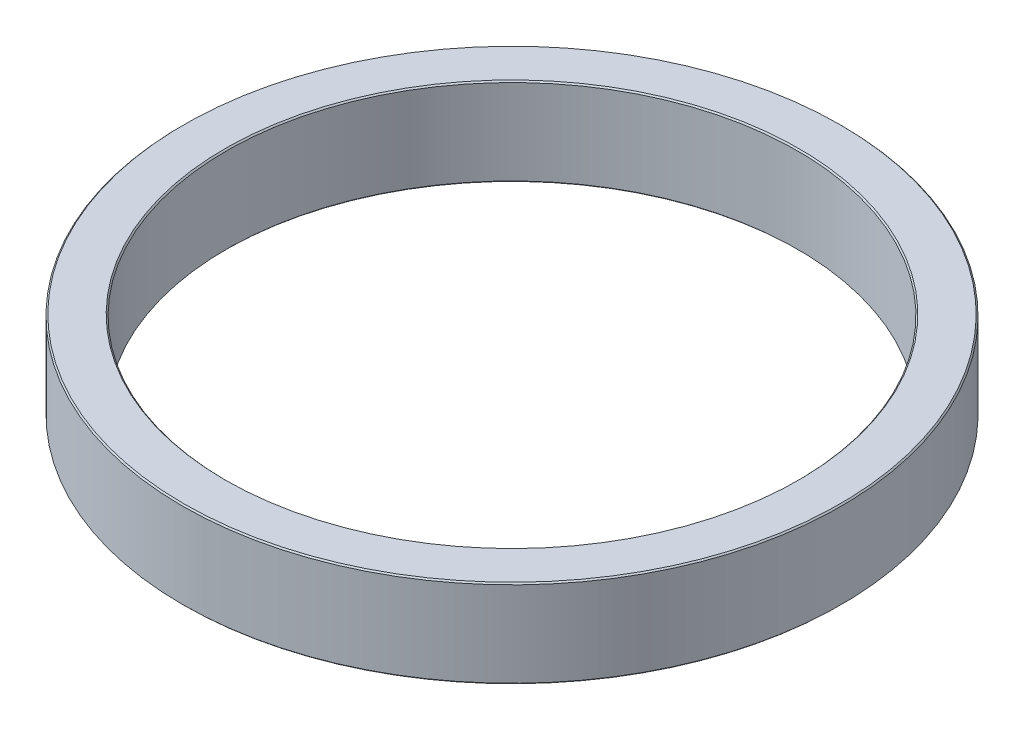
ISO-10303-21;
HEADER;
FILE_DESCRIPTION(('STEP AP214'),'2;1');
FILE_NAME('part.step','',(''),(''),'','','');
FILE_SCHEMA(('AUTOMOTIVE_DESIGN { 1 0 10303 214 1 1 1 1 }'));
ENDSEC;
DATA;
#1=APPLICATION_CONTEXT('core data for automotive mechanical design processes');
#2=APPLICATION_PROTOCOL_DEFINITION('international standard','automotive_design',2000,#1);
#3=PRODUCT_CONTEXT('',#1,'mechanical');
#4=PRODUCT('Part','Part','',(#3));
#5=PRODUCT_RELATED_PRODUCT_CATEGORY('part','',(#4));
#6=PRODUCT_DEFINITION_FORMATION('','',#4);
#7=PRODUCT_DEFINITION_CONTEXT('part definition',#1,'design');
#8=PRODUCT_DEFINITION('design','',#6,#7);
#9=PRODUCT_DEFINITION_SHAPE('','',#8);
#10=(LENGTH_UNIT() NAMED_UNIT(*) SI_UNIT(.MILLI.,.METRE.));
#11=(NAMED_UNIT(*) PLANE_ANGLE_UNIT() SI_UNIT($,.RADIAN.));
#12=(NAMED_UNIT(*) SI_UNIT($,.STERADIAN.) SOLID_ANGLE_UNIT());
#13=UNCERTAINTY_MEASURE_WITH_UNIT(LENGTH_MEASURE(1.E-05),#10,'distance_accuracy_value','');
#14=(GEOMETRIC_REPRESENTATION_CONTEXT(3) GLOBAL_UNCERTAINTY_ASSIGNED_CONTEXT((#13)) GLOBAL_UNIT_ASSIGNED_CONTEXT((#10,
#11,#12)) REPRESENTATION_CONTEXT('',''));
#15=CARTESIAN_POINT('',(0.,0.,0.));
#16=DIRECTION('',(0.,0.,1.));
#17=DIRECTION('',(1.,0.,0.));
#18=AXIS2_PLACEMENT_3D('',#15,#16,#17);
#19=CARTESIAN_POINT('',(0.,10.,0.));
#20=DIRECTION('',(0.,1.,0.));
#21=DIRECTION('',(0.,0.,1.));
#22=AXIS2_PLACEMENT_3D('',#19,#20,#21);
#23=PLANE('',#22);
#24=CARTESIAN_POINT('',(0.,10.,0.));
#25=DIRECTION('',(0.,1.,0.));
#26=DIRECTION('',(0.,0.,1.));
#27=AXIS2_PLACEMENT_3D('',#24,#25,#26);
#28=CIRCLE('',#27,37.345);
#29=CARTESIAN_POINT('',(0.,10.,37.345));
#30=VERTEX_POINT('',#29);
#31=EDGE_CURVE('E45',#30,#30,#28,.T.);
#32=ORIENTED_EDGE('',*,*,#31,.T.);
#33=EDGE_LOOP('',(#32));
#34=FACE_BOUND('',#33,.T.);
#35=CARTESIAN_POINT('',(0.,10.,0.));
#36=DIRECTION('',(0.,1.,0.));
#37=DIRECTION('',(0.,0.,1.));
#38=AXIS2_PLACEMENT_3D('',#35,#36,#37);
#39=CIRCLE('',#38,32.65);
#40=CARTESIAN_POINT('',(0.,10.,32.65));
#41=VERTEX_POINT('',#40);
#42=EDGE_CURVE('E49',#41,#41,#39,.F.);
#43=ORIENTED_EDGE('',*,*,#42,.T.);
#44=EDGE_LOOP('',(#43));
#45=FACE_BOUND('',#44,.T.);
#46=ADVANCED_FACE('F33',(#34,#45),#23,.T.);
#47=CARTESIAN_POINT('',(0.,0.,0.));
#48=DIRECTION('',(0.,1.,0.));
#49=DIRECTION('',(0.,0.,1.));
#50=AXIS2_PLACEMENT_3D('',#47,#48,#49);
#51=PLANE('',#50);
#52=CARTESIAN_POINT('',(0.,0.,0.));
#53=DIRECTION('',(0.,1.,0.));
#54=DIRECTION('',(0.,0.,1.));
#55=AXIS2_PLACEMENT_3D('',#52,#53,#54);
#56=CIRCLE('',#55,37.345);
#57=CARTESIAN_POINT('',(0.,0.,37.345));
#58=VERTEX_POINT('',#57);
#59=EDGE_CURVE('E54',#58,#58,#56,.F.);
#60=ORIENTED_EDGE('',*,*,#59,.T.);
#61=EDGE_LOOP('',(#60));
#62=FACE_BOUND('',#61,.T.);
#63=CARTESIAN_POINT('',(0.,0.,0.));
#64=DIRECTION('',(0.,1.,0.));
#65=DIRECTION('',(0.,0.,1.));
#66=AXIS2_PLACEMENT_3D('',#63,#64,#65);
#67=CIRCLE('',#66,32.65);
#68=CARTESIAN_POINT('',(0.,0.,32.65));
#69=VERTEX_POINT('',#68);
#70=EDGE_CURVE('E57',#69,#69,#67,.T.);
#71=ORIENTED_EDGE('',*,*,#70,.T.);
#72=EDGE_LOOP('',(#71));
#73=FACE_BOUND('',#72,.T.);
#74=ADVANCED_FACE('F79',(#62,#73),#51,.F.);
#75=CARTESIAN_POINT('',(0.,10.,0.));
#76=DIRECTION('',(0.,-1.,0.));
#77=DIRECTION('',(0.,0.,-1.));
#78=AXIS2_PLACEMENT_3D('',#75,#76,#77);
#79=CYLINDRICAL_SURFACE('',#78,37.495);
#80=CARTESIAN_POINT('',(0.,0.150000000000004,0.));
#81=DIRECTION('',(0.,1.,0.));
#82=DIRECTION('',(0.,0.,1.));
#83=AXIS2_PLACEMENT_3D('',#80,#81,#82);
#84=CIRCLE('',#83,37.495);
#85=CARTESIAN_POINT('',(0.,0.150000000000004,37.495));
#86=VERTEX_POINT('',#85);
#87=EDGE_CURVE('E60',#86,#86,#84,.T.);
#88=ORIENTED_EDGE('',*,*,#87,.T.);
#89=EDGE_LOOP('',(#88));
#90=FACE_BOUND('',#89,.T.);
#91=CARTESIAN_POINT('',(0.,9.85000000000004,0.));
#92=DIRECTION('',(0.,1.,0.));
#93=DIRECTION('',(0.,0.,1.));
#94=AXIS2_PLACEMENT_3D('',#91,#92,#93);
#95=CIRCLE('',#94,37.495);
#96=CARTESIAN_POINT('',(0.,9.85000000000004,37.495));
#97=VERTEX_POINT('',#96);
#98=EDGE_CURVE('E63',#97,#97,#95,.F.);
#99=ORIENTED_EDGE('',*,*,#98,.T.);
#100=EDGE_LOOP('',(#99));
#101=FACE_BOUND('',#100,.T.);
#102=ADVANCED_FACE('F67',(#90,#101),#79,.T.);
#103=CARTESIAN_POINT('',(0.,10.,0.));
#104=DIRECTION('',(0.,-1.,0.));
#105=DIRECTION('',(0.,0.,-1.));
#106=AXIS2_PLACEMENT_3D('',#103,#104,#105);
#107=CYLINDRICAL_SURFACE('',#106,32.5);
#108=CARTESIAN_POINT('',(0.,0.149999999999983,0.));
#109=DIRECTION('',(0.,1.,0.));
#110=DIRECTION('',(0.,0.,1.));
#111=AXIS2_PLACEMENT_3D('',#108,#109,#110);
#112=CIRCLE('',#111,32.5);
#113=CARTESIAN_POINT('',(0.,0.149999999999983,32.5));
#114=VERTEX_POINT('',#113);
#115=EDGE_CURVE('E10',#114,#114,#112,.F.);
#116=ORIENTED_EDGE('',*,*,#115,.T.);
#117=EDGE_LOOP('',(#116));
#118=FACE_BOUND('',#117,.T.);
#119=CARTESIAN_POINT('',(0.,9.84999999999999,0.));
#120=DIRECTION('',(0.,1.,0.));
#121=DIRECTION('',(0.,0.,1.));
#122=AXIS2_PLACEMENT_3D('',#119,#120,#121);
#123=CIRCLE('',#122,32.5);
#124=CARTESIAN_POINT('',(0.,9.84999999999999,32.5));
#125=VERTEX_POINT('',#124);
#126=EDGE_CURVE('E41',#125,#125,#123,.T.);
#127=ORIENTED_EDGE('',*,*,#126,.T.);
#128=EDGE_LOOP('',(#127));
#129=FACE_BOUND('',#128,.T.);
#130=ADVANCED_FACE('F104',(#118,#129),#107,.F.);
#131=CARTESIAN_POINT('',(0.,0.150000000000004,0.));
#132=DIRECTION('',(0.,1.,0.));
#133=DIRECTION('',(0.,0.,1.));
#134=AXIS2_PLACEMENT_3D('',#131,#132,#133);
#135=CONICAL_SURFACE('',#134,37.495,0.785398163397425);
#136=ORIENTED_EDGE('',*,*,#59,.F.);
#137=EDGE_LOOP('',(#136));
#138=FACE_BOUND('',#137,.T.);
#139=ORIENTED_EDGE('',*,*,#87,.F.);
#140=EDGE_LOOP('',(#139));
#141=FACE_BOUND('',#140,.T.);
#142=ADVANCED_FACE('F73',(#138,#141),#135,.T.);
#143=CARTESIAN_POINT('',(0.,10.,0.));
#144=DIRECTION('',(0.,-1.,0.));
#145=DIRECTION('',(0.,0.,-1.));
#146=AXIS2_PLACEMENT_3D('',#143,#144,#145);
#147=CONICAL_SURFACE('',#146,37.345,0.785398163397448);
#148=ORIENTED_EDGE('',*,*,#98,.F.);
#149=EDGE_LOOP('',(#148));
#150=FACE_BOUND('',#149,.T.);
#151=ORIENTED_EDGE('',*,*,#31,.F.);
#152=EDGE_LOOP('',(#151));
#153=FACE_BOUND('',#152,.T.);
#154=ADVANCED_FACE('F69',(#150,#153),#147,.T.);
#155=CARTESIAN_POINT('',(0.,0.,0.));
#156=DIRECTION('',(0.,-1.,0.));
#157=DIRECTION('',(0.,0.,-1.));
#158=AXIS2_PLACEMENT_3D('',#155,#156,#157);
#159=CONICAL_SURFACE('',#158,32.65,0.785398163397471);
#160=ORIENTED_EDGE('',*,*,#115,.F.);
#161=EDGE_LOOP('',(#160));
#162=FACE_BOUND('',#161,.T.);
#163=ORIENTED_EDGE('',*,*,#70,.F.);
#164=EDGE_LOOP('',(#163));
#165=FACE_BOUND('',#164,.T.);
#166=ADVANCED_FACE('F72',(#162,#165),#159,.F.);
#167=CARTESIAN_POINT('',(0.,9.84999999999999,0.));
#168=DIRECTION('',(0.,1.,0.));
#169=DIRECTION('',(0.,0.,1.));
#170=AXIS2_PLACEMENT_3D('',#167,#168,#169);
#171=CONICAL_SURFACE('',#170,32.5,0.785398163397448);
#172=ORIENTED_EDGE('',*,*,#42,.F.);
#173=EDGE_LOOP('',(#172));
#174=FACE_BOUND('',#173,.T.);
#175=ORIENTED_EDGE('',*,*,#126,.F.);
#176=EDGE_LOOP('',(#175));
#177=FACE_BOUND('',#176,.T.);
#178=ADVANCED_FACE('F36',(#174,#177),#171,.F.);
#179=CLOSED_SHELL('',(#46,#74,#102,#130,#142,#154,#166,#178));
#180=MANIFOLD_SOLID_BREP('B2',#179);
#181=ADVANCED_BREP_SHAPE_REPRESENTATION('',(#18,#180),#14);
#182=SHAPE_DEFINITION_REPRESENTATION(#9,#181);
ENDSEC;
END-ISO-10303-21;
